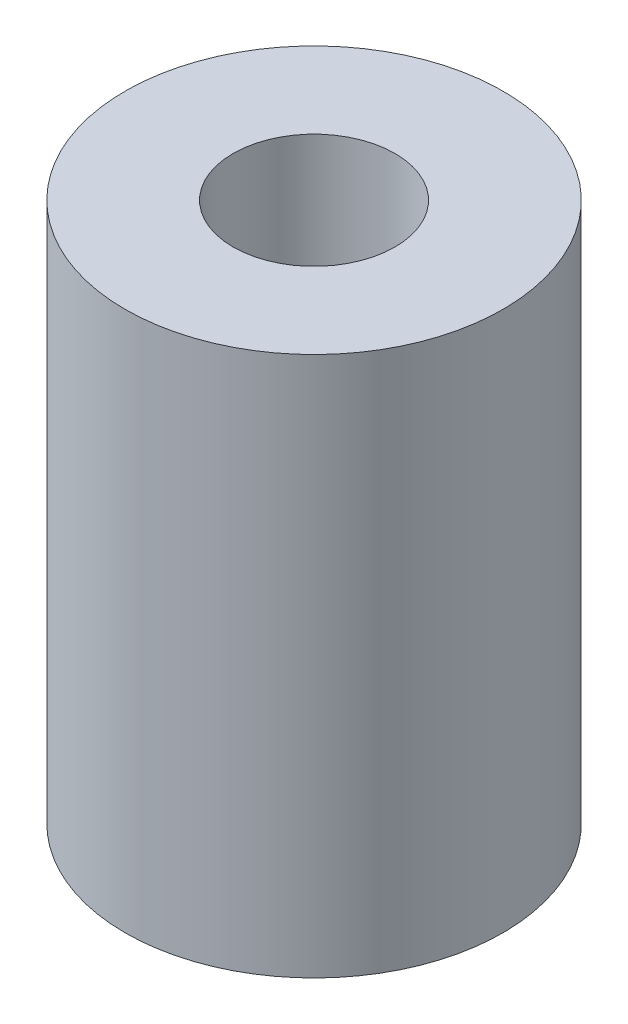
ISO-10303-21;
HEADER;
FILE_DESCRIPTION(('STEP AP214'),'2;1');
FILE_NAME('part.step','',(''),(''),'','','');
FILE_SCHEMA(('AUTOMOTIVE_DESIGN { 1 0 10303 214 1 1 1 1 }'));
ENDSEC;
DATA;
#1=APPLICATION_CONTEXT('core data for automotive mechanical design processes');
#2=APPLICATION_PROTOCOL_DEFINITION('international standard','automotive_design',2000,#1);
#3=PRODUCT_CONTEXT('',#1,'mechanical');
#4=PRODUCT('Part','Part','',(#3));
#5=PRODUCT_RELATED_PRODUCT_CATEGORY('part','',(#4));
#6=PRODUCT_DEFINITION_FORMATION('','',#4);
#7=PRODUCT_DEFINITION_CONTEXT('part definition',#1,'design');
#8=PRODUCT_DEFINITION('design','',#6,#7);
#9=PRODUCT_DEFINITION_SHAPE('','',#8);
#10=(LENGTH_UNIT() NAMED_UNIT(*) SI_UNIT(.MILLI.,.METRE.));
#11=(NAMED_UNIT(*) PLANE_ANGLE_UNIT() SI_UNIT($,.RADIAN.));
#12=(NAMED_UNIT(*) SI_UNIT($,.STERADIAN.) SOLID_ANGLE_UNIT());
#13=UNCERTAINTY_MEASURE_WITH_UNIT(LENGTH_MEASURE(1.E-05),#10,'distance_accuracy_value','');
#14=(GEOMETRIC_REPRESENTATION_CONTEXT(3) GLOBAL_UNCERTAINTY_ASSIGNED_CONTEXT((#13)) GLOBAL_UNIT_ASSIGNED_CONTEXT((#10,
#11,#12)) REPRESENTATION_CONTEXT('',''));
#15=CARTESIAN_POINT('',(0.,0.,0.));
#16=DIRECTION('',(0.,0.,1.));
#17=DIRECTION('',(1.,0.,0.));
#18=AXIS2_PLACEMENT_3D('',#15,#16,#17);
#19=CARTESIAN_POINT('',(0.,10.,0.));
#20=DIRECTION('',(0.,1.,0.));
#21=DIRECTION('',(0.,0.,1.));
#22=AXIS2_PLACEMENT_3D('',#19,#20,#21);
#23=PLANE('',#22);
#24=CARTESIAN_POINT('',(0.,10.,0.));
#25=DIRECTION('',(0.,1.,0.));
#26=DIRECTION('',(0.,0.,1.));
#27=AXIS2_PLACEMENT_3D('',#24,#25,#26);
#28=CIRCLE('',#27,3.5);
#29=CARTESIAN_POINT('',(0.,10.,3.5));
#30=VERTEX_POINT('',#29);
#31=EDGE_CURVE('E10',#30,#30,#28,.T.);
#32=ORIENTED_EDGE('',*,*,#31,.T.);
#33=EDGE_LOOP('',(#32));
#34=FACE_BOUND('',#33,.T.);
#35=CARTESIAN_POINT('',(0.,10.,0.));
#36=DIRECTION('',(0.,1.,0.));
#37=DIRECTION('',(0.,0.,1.));
#38=AXIS2_PLACEMENT_3D('',#35,#36,#37);
#39=CIRCLE('',#38,1.5);
#40=CARTESIAN_POINT('',(0.,10.,1.5));
#41=VERTEX_POINT('',#40);
#42=EDGE_CURVE('E42',#41,#41,#39,.T.);
#43=ORIENTED_EDGE('',*,*,#42,.F.);
#44=EDGE_LOOP('',(#43));
#45=FACE_BOUND('',#44,.T.);
#46=ADVANCED_FACE('F31',(#34,#45),#23,.T.);
#47=CARTESIAN_POINT('',(0.,0.,0.));
#48=DIRECTION('',(0.,1.,0.));
#49=DIRECTION('',(0.,0.,1.));
#50=AXIS2_PLACEMENT_3D('',#47,#48,#49);
#51=PLANE('',#50);
#52=CARTESIAN_POINT('',(0.,0.,0.));
#53=DIRECTION('',(0.,1.,0.));
#54=DIRECTION('',(0.,0.,1.));
#55=AXIS2_PLACEMENT_3D('',#52,#53,#54);
#56=CIRCLE('',#55,3.5);
#57=CARTESIAN_POINT('',(0.,0.,3.5));
#58=VERTEX_POINT('',#57);
#59=EDGE_CURVE('E35',#58,#58,#56,.T.);
#60=ORIENTED_EDGE('',*,*,#59,.F.);
#61=EDGE_LOOP('',(#60));
#62=FACE_BOUND('',#61,.T.);
#63=CARTESIAN_POINT('',(0.,0.,0.));
#64=DIRECTION('',(0.,1.,0.));
#65=DIRECTION('',(0.,0.,1.));
#66=AXIS2_PLACEMENT_3D('',#63,#64,#65);
#67=CIRCLE('',#66,1.5);
#68=CARTESIAN_POINT('',(0.,0.,1.5));
#69=VERTEX_POINT('',#68);
#70=EDGE_CURVE('E44',#69,#69,#67,.T.);
#71=ORIENTED_EDGE('',*,*,#70,.T.);
#72=EDGE_LOOP('',(#71));
#73=FACE_BOUND('',#72,.T.);
#74=ADVANCED_FACE('F54',(#62,#73),#51,.F.);
#75=CARTESIAN_POINT('',(0.,10.,0.));
#76=DIRECTION('',(0.,-1.,0.));
#77=DIRECTION('',(0.,0.,-1.));
#78=AXIS2_PLACEMENT_3D('',#75,#76,#77);
#79=CYLINDRICAL_SURFACE('',#78,3.5);
#80=ORIENTED_EDGE('',*,*,#31,.F.);
#81=EDGE_LOOP('',(#80));
#82=FACE_BOUND('',#81,.T.);
#83=ORIENTED_EDGE('',*,*,#59,.T.);
#84=EDGE_LOOP('',(#83));
#85=FACE_BOUND('',#84,.T.);
#86=ADVANCED_FACE('F33',(#82,#85),#79,.T.);
#87=CARTESIAN_POINT('',(0.,10.,0.));
#88=DIRECTION('',(0.,-1.,0.));
#89=DIRECTION('',(0.,0.,-1.));
#90=AXIS2_PLACEMENT_3D('',#87,#88,#89);
#91=CYLINDRICAL_SURFACE('',#90,1.5);
#92=ORIENTED_EDGE('',*,*,#42,.T.);
#93=EDGE_LOOP('',(#92));
#94=FACE_BOUND('',#93,.T.);
#95=ORIENTED_EDGE('',*,*,#70,.F.);
#96=EDGE_LOOP('',(#95));
#97=FACE_BOUND('',#96,.T.);
#98=ADVANCED_FACE('F50',(#94,#97),#91,.F.);
#99=CLOSED_SHELL('',(#46,#74,#86,#98));
#100=MANIFOLD_SOLID_BREP('B2',#99);
#101=ADVANCED_BREP_SHAPE_REPRESENTATION('',(#18,#100),#14);
#102=SHAPE_DEFINITION_REPRESENTATION(#9,#101);
ENDSEC;
END-ISO-10303-21;
